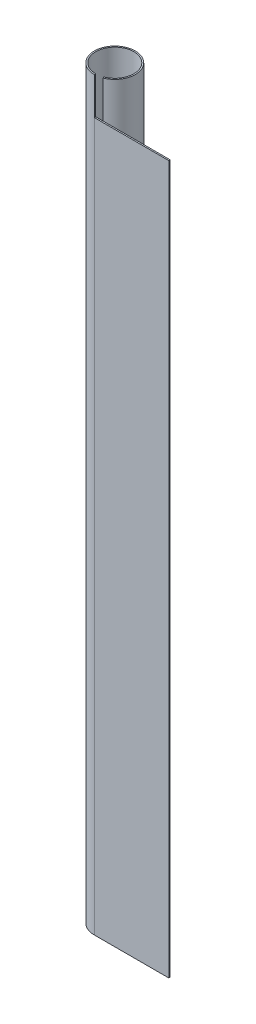
ISO-10303-21;
HEADER;
FILE_DESCRIPTION(('STEP AP214'),'2;1');
FILE_NAME('part.step','',(''),(''),'','','');
FILE_SCHEMA(('AUTOMOTIVE_DESIGN { 1 0 10303 214 1 1 1 1 }'));
ENDSEC;
DATA;
#1=APPLICATION_CONTEXT('core data for automotive mechanical design processes');
#2=APPLICATION_PROTOCOL_DEFINITION('international standard','automotive_design',2000,#1);
#3=PRODUCT_CONTEXT('',#1,'mechanical');
#4=PRODUCT('Part','Part','',(#3));
#5=PRODUCT_RELATED_PRODUCT_CATEGORY('part','',(#4));
#6=PRODUCT_DEFINITION_FORMATION('','',#4);
#7=PRODUCT_DEFINITION_CONTEXT('part definition',#1,'design');
#8=PRODUCT_DEFINITION('design','',#6,#7);
#9=PRODUCT_DEFINITION_SHAPE('','',#8);
#10=(LENGTH_UNIT() NAMED_UNIT(*) SI_UNIT(.MILLI.,.METRE.));
#11=(NAMED_UNIT(*) PLANE_ANGLE_UNIT() SI_UNIT($,.RADIAN.));
#12=(NAMED_UNIT(*) SI_UNIT($,.STERADIAN.) SOLID_ANGLE_UNIT());
#13=UNCERTAINTY_MEASURE_WITH_UNIT(LENGTH_MEASURE(1.E-05),#10,'distance_accuracy_value','');
#14=(GEOMETRIC_REPRESENTATION_CONTEXT(3) GLOBAL_UNCERTAINTY_ASSIGNED_CONTEXT((#13)) GLOBAL_UNIT_ASSIGNED_CONTEXT((#10,
#11,#12)) REPRESENTATION_CONTEXT('',''));
#15=CARTESIAN_POINT('',(0.,0.,0.));
#16=DIRECTION('',(0.,0.,1.));
#17=DIRECTION('',(1.,0.,0.));
#18=AXIS2_PLACEMENT_3D('',#15,#16,#17);
#19=CARTESIAN_POINT('',(0.,-400.,0.));
#20=DIRECTION('',(0.,-1.,0.));
#21=DIRECTION('',(0.,0.,-1.));
#22=AXIS2_PLACEMENT_3D('',#19,#20,#21);
#23=PLANE('',#22);
#24=DIRECTION('',(0.,0.,-1.));
#25=VECTOR('',#24,1.);
#26=CARTESIAN_POINT('',(0.,-400.,0.));
#27=LINE('',#26,#25);
#28=CARTESIAN_POINT('',(0.,-400.,0.));
#29=VERTEX_POINT('',#28);
#30=CARTESIAN_POINT('',(0.,-400.,-0.7366));
#31=VERTEX_POINT('',#30);
#32=EDGE_CURVE('E11',#29,#31,#27,.T.);
#33=ORIENTED_EDGE('',*,*,#32,.F.);
#34=CARTESIAN_POINT('',(0.,-400.,-11.));
#35=DIRECTION('',(0.,-1.,0.));
#36=DIRECTION('',(0.,0.,-1.));
#37=AXIS2_PLACEMENT_3D('',#34,#35,#36);
#38=CIRCLE('',#37,11.);
#39=CARTESIAN_POINT('',(3.99217985566783,-400.,-0.750000000000002));
#40=VERTEX_POINT('',#39);
#41=EDGE_CURVE('E118',#29,#40,#38,.T.);
#42=ORIENTED_EDGE('',*,*,#41,.T.);
#43=DIRECTION('',(-0.362925441424352,0.,-0.93181818181818));
#44=VECTOR('',#43,1.);
#45=CARTESIAN_POINT('',(3.99217985566783,-400.,-0.750000000000002));
#46=LINE('',#45,#44);
#47=CARTESIAN_POINT('',(3.72484897551465,-400.,-1.43637727272727));
#48=VERTEX_POINT('',#47);
#49=EDGE_CURVE('E83',#40,#48,#46,.T.);
#50=ORIENTED_EDGE('',*,*,#49,.T.);
#51=CARTESIAN_POINT('',(0.,-400.,-11.));
#52=DIRECTION('',(0.,1.,0.));
#53=DIRECTION('',(1.,0.,0.));
#54=AXIS2_PLACEMENT_3D('',#51,#52,#53);
#55=CIRCLE('',#54,10.2634);
#56=EDGE_CURVE('E133',#31,#48,#55,.F.);
#57=ORIENTED_EDGE('',*,*,#56,.F.);
#58=EDGE_LOOP('',(#33,#42,#50,#57));
#59=FACE_BOUND('',#58,.T.);
#60=ADVANCED_FACE('F36',(#59),#23,.T.);
#61=CARTESIAN_POINT('',(0.,0.,-0.7366));
#62=DIRECTION('',(0.,1.,0.));
#63=DIRECTION('',(0.,0.,1.));
#64=AXIS2_PLACEMENT_3D('',#61,#62,#63);
#65=PLANE('',#64);
#66=DIRECTION('',(0.,0.,1.));
#67=VECTOR('',#66,1.);
#68=CARTESIAN_POINT('',(0.,0.,-0.7366));
#69=LINE('',#68,#67);
#70=CARTESIAN_POINT('',(0.,0.,-0.7366));
#71=VERTEX_POINT('',#70);
#72=CARTESIAN_POINT('',(0.,0.,0.));
#73=VERTEX_POINT('',#72);
#74=EDGE_CURVE('E44',#71,#73,#69,.T.);
#75=ORIENTED_EDGE('',*,*,#74,.F.);
#76=CARTESIAN_POINT('',(0.,0.,-11.));
#77=DIRECTION('',(0.,1.,0.));
#78=DIRECTION('',(1.,0.,0.));
#79=AXIS2_PLACEMENT_3D('',#76,#77,#78);
#80=CIRCLE('',#79,10.2634);
#81=CARTESIAN_POINT('',(3.72484897551465,0.,-1.43637727272727));
#82=VERTEX_POINT('',#81);
#83=EDGE_CURVE('E125',#71,#82,#80,.F.);
#84=ORIENTED_EDGE('',*,*,#83,.T.);
#85=DIRECTION('',(-0.362925441424352,0.,-0.93181818181818));
#86=VECTOR('',#85,1.);
#87=CARTESIAN_POINT('',(3.99217985566783,0.,-0.750000000000002));
#88=LINE('',#87,#86);
#89=CARTESIAN_POINT('',(3.99217985566783,0.,-0.750000000000002));
#90=VERTEX_POINT('',#89);
#91=EDGE_CURVE('E128',#90,#82,#88,.T.);
#92=ORIENTED_EDGE('',*,*,#91,.F.);
#93=CARTESIAN_POINT('',(0.,0.,-11.));
#94=DIRECTION('',(0.,-1.,0.));
#95=DIRECTION('',(0.,0.,-1.));
#96=AXIS2_PLACEMENT_3D('',#93,#94,#95);
#97=CIRCLE('',#96,11.);
#98=EDGE_CURVE('E66',#73,#90,#97,.T.);
#99=ORIENTED_EDGE('',*,*,#98,.F.);
#100=EDGE_LOOP('',(#75,#84,#92,#99));
#101=FACE_BOUND('',#100,.T.);
#102=ADVANCED_FACE('F152',(#101),#65,.T.);
#103=CARTESIAN_POINT('',(0.,-400.,-11.));
#104=DIRECTION('',(0.,1.,0.));
#105=DIRECTION('',(0.,0.,1.));
#106=AXIS2_PLACEMENT_3D('',#103,#104,#105);
#107=CYLINDRICAL_SURFACE('',#106,10.2634);
#108=ORIENTED_EDGE('',*,*,#83,.F.);
#109=DIRECTION('',(0.,-1.,0.));
#110=VECTOR('',#109,1.);
#111=CARTESIAN_POINT('',(0.,0.,-0.7366));
#112=LINE('',#111,#110);
#113=CARTESIAN_POINT('',(0.,-20.,-0.7366));
#114=VERTEX_POINT('',#113);
#115=EDGE_CURVE('E74',#71,#114,#112,.T.);
#116=ORIENTED_EDGE('',*,*,#115,.T.);
#117=DIRECTION('',(0.,1.,0.));
#118=VECTOR('',#117,1.);
#119=CARTESIAN_POINT('',(0.,-400.,-0.7366));
#120=LINE('',#119,#118);
#121=EDGE_CURVE('E134',#31,#114,#120,.T.);
#122=ORIENTED_EDGE('',*,*,#121,.F.);
#123=ORIENTED_EDGE('',*,*,#56,.T.);
#124=DIRECTION('',(0.,1.,0.));
#125=VECTOR('',#124,1.);
#126=CARTESIAN_POINT('',(3.72484897551465,-400.,-1.43637727272727));
#127=LINE('',#126,#125);
#128=EDGE_CURVE('E124',#48,#82,#127,.T.);
#129=ORIENTED_EDGE('',*,*,#128,.T.);
#130=EDGE_LOOP('',(#108,#116,#122,#123,#129));
#131=FACE_BOUND('',#130,.T.);
#132=ADVANCED_FACE('F176',(#131),#107,.F.);
#133=CARTESIAN_POINT('',(0.,-400.,-0.7366));
#134=DIRECTION('',(0.,0.,-1.));
#135=DIRECTION('',(-1.,0.,0.));
#136=AXIS2_PLACEMENT_3D('',#133,#134,#135);
#137=PLANE('',#136);
#138=DIRECTION('',(1.,0.,0.));
#139=VECTOR('',#138,1.);
#140=CARTESIAN_POINT('',(0.,-20.,-0.7366));
#141=LINE('',#140,#139);
#142=CARTESIAN_POINT('',(40.,-20.,-0.7366));
#143=VERTEX_POINT('',#142);
#144=EDGE_CURVE('E163',#114,#143,#141,.T.);
#145=ORIENTED_EDGE('',*,*,#144,.T.);
#146=DIRECTION('',(0.,1.,0.));
#147=VECTOR('',#146,1.);
#148=CARTESIAN_POINT('',(40.,-400.,-0.7366));
#149=LINE('',#148,#147);
#150=CARTESIAN_POINT('',(40.,-400.,-0.7366));
#151=VERTEX_POINT('',#150);
#152=EDGE_CURVE('E112',#151,#143,#149,.T.);
#153=ORIENTED_EDGE('',*,*,#152,.F.);
#154=DIRECTION('',(1.,0.,0.));
#155=VECTOR('',#154,1.);
#156=CARTESIAN_POINT('',(0.,-400.,-0.7366));
#157=LINE('',#156,#155);
#158=EDGE_CURVE('E99',#151,#31,#157,.F.);
#159=ORIENTED_EDGE('',*,*,#158,.T.);
#160=ORIENTED_EDGE('',*,*,#121,.T.);
#161=EDGE_LOOP('',(#145,#153,#159,#160));
#162=FACE_BOUND('',#161,.T.);
#163=ADVANCED_FACE('F160',(#162),#137,.T.);
#164=CARTESIAN_POINT('',(40.,-400.,-0.7366));
#165=DIRECTION('',(-1.,0.,0.));
#166=DIRECTION('',(0.,0.,1.));
#167=AXIS2_PLACEMENT_3D('',#164,#165,#166);
#168=PLANE('',#167);
#169=ORIENTED_EDGE('',*,*,#152,.T.);
#170=DIRECTION('',(0.,0.,1.));
#171=VECTOR('',#170,1.);
#172=CARTESIAN_POINT('',(40.,-20.,-22.001));
#173=LINE('',#172,#171);
#174=CARTESIAN_POINT('',(40.,-20.,0.));
#175=VERTEX_POINT('',#174);
#176=EDGE_CURVE('E109',#143,#175,#173,.T.);
#177=ORIENTED_EDGE('',*,*,#176,.T.);
#178=DIRECTION('',(0.,1.,0.));
#179=VECTOR('',#178,1.);
#180=CARTESIAN_POINT('',(40.,-400.,0.));
#181=LINE('',#180,#179);
#182=CARTESIAN_POINT('',(40.,-400.,0.));
#183=VERTEX_POINT('',#182);
#184=EDGE_CURVE('E105',#183,#175,#181,.T.);
#185=ORIENTED_EDGE('',*,*,#184,.F.);
#186=DIRECTION('',(0.,0.,1.));
#187=VECTOR('',#186,1.);
#188=CARTESIAN_POINT('',(40.,-400.,-0.7366));
#189=LINE('',#188,#187);
#190=EDGE_CURVE('E92',#151,#183,#189,.T.);
#191=ORIENTED_EDGE('',*,*,#190,.F.);
#192=EDGE_LOOP('',(#169,#177,#185,#191));
#193=FACE_BOUND('',#192,.T.);
#194=ADVANCED_FACE('F106',(#193),#168,.F.);
#195=CARTESIAN_POINT('',(0.,-400.,0.));
#196=DIRECTION('',(0.,0.,-1.));
#197=DIRECTION('',(-1.,0.,0.));
#198=AXIS2_PLACEMENT_3D('',#195,#196,#197);
#199=PLANE('',#198);
#200=ORIENTED_EDGE('',*,*,#184,.T.);
#201=DIRECTION('',(1.,0.,0.));
#202=VECTOR('',#201,1.);
#203=CARTESIAN_POINT('',(0.,-20.,0.));
#204=LINE('',#203,#202);
#205=CARTESIAN_POINT('',(0.,-20.,0.));
#206=VERTEX_POINT('',#205);
#207=EDGE_CURVE('E129',#206,#175,#204,.T.);
#208=ORIENTED_EDGE('',*,*,#207,.F.);
#209=DIRECTION('',(0.,1.,0.));
#210=VECTOR('',#209,1.);
#211=CARTESIAN_POINT('',(0.,-400.,0.));
#212=LINE('',#211,#210);
#213=EDGE_CURVE('E113',#29,#206,#212,.T.);
#214=ORIENTED_EDGE('',*,*,#213,.F.);
#215=DIRECTION('',(-1.,0.,0.));
#216=VECTOR('',#215,1.);
#217=CARTESIAN_POINT('',(0.,-400.,0.));
#218=LINE('',#217,#216);
#219=EDGE_CURVE('E96',#183,#29,#218,.T.);
#220=ORIENTED_EDGE('',*,*,#219,.F.);
#221=EDGE_LOOP('',(#200,#208,#214,#220));
#222=FACE_BOUND('',#221,.T.);
#223=ADVANCED_FACE('F115',(#222),#199,.F.);
#224=CARTESIAN_POINT('',(0.,-400.,-11.));
#225=DIRECTION('',(0.,1.,0.));
#226=DIRECTION('',(0.,0.,1.));
#227=AXIS2_PLACEMENT_3D('',#224,#225,#226);
#228=CYLINDRICAL_SURFACE('',#227,11.);
#229=ORIENTED_EDGE('',*,*,#98,.T.);
#230=DIRECTION('',(0.,1.,0.));
#231=VECTOR('',#230,1.);
#232=CARTESIAN_POINT('',(3.99217985566783,-400.,-0.750000000000002));
#233=LINE('',#232,#231);
#234=EDGE_CURVE('E139',#40,#90,#233,.T.);
#235=ORIENTED_EDGE('',*,*,#234,.F.);
#236=ORIENTED_EDGE('',*,*,#41,.F.);
#237=ORIENTED_EDGE('',*,*,#213,.T.);
#238=DIRECTION('',(0.,-1.,0.));
#239=VECTOR('',#238,1.);
#240=CARTESIAN_POINT('',(0.,0.,0.));
#241=LINE('',#240,#239);
#242=EDGE_CURVE('E145',#73,#206,#241,.T.);
#243=ORIENTED_EDGE('',*,*,#242,.F.);
#244=EDGE_LOOP('',(#229,#235,#236,#237,#243));
#245=FACE_BOUND('',#244,.T.);
#246=ADVANCED_FACE('F148',(#245),#228,.T.);
#247=CARTESIAN_POINT('',(3.99217985566783,-400.,-0.750000000000002));
#248=DIRECTION('',(0.93181818181818,0.,-0.362925441424352));
#249=DIRECTION('',(-0.362925441424352,0.,-0.93181818181818));
#250=AXIS2_PLACEMENT_3D('',#247,#248,#249);
#251=PLANE('',#250);
#252=ORIENTED_EDGE('',*,*,#91,.T.);
#253=ORIENTED_EDGE('',*,*,#128,.F.);
#254=ORIENTED_EDGE('',*,*,#49,.F.);
#255=ORIENTED_EDGE('',*,*,#234,.T.);
#256=EDGE_LOOP('',(#252,#253,#254,#255));
#257=FACE_BOUND('',#256,.T.);
#258=ADVANCED_FACE('F154',(#257),#251,.F.);
#259=CARTESIAN_POINT('',(0.,-400.,-11.));
#260=DIRECTION('',(0.,1.,0.));
#261=DIRECTION('',(1.,0.,0.));
#262=AXIS2_PLACEMENT_3D('',#259,#260,#261);
#263=PLANE('',#262);
#264=ORIENTED_EDGE('',*,*,#219,.T.);
#265=ORIENTED_EDGE('',*,*,#32,.T.);
#266=ORIENTED_EDGE('',*,*,#158,.F.);
#267=ORIENTED_EDGE('',*,*,#190,.T.);
#268=EDGE_LOOP('',(#264,#265,#266,#267));
#269=FACE_BOUND('',#268,.T.);
#270=ADVANCED_FACE('F94',(#269),#263,.F.);
#271=CARTESIAN_POINT('',(0.,-20.,-22.001));
#272=DIRECTION('',(0.,-1.,0.));
#273=DIRECTION('',(1.,0.,0.));
#274=AXIS2_PLACEMENT_3D('',#271,#272,#273);
#275=PLANE('',#274);
#276=DIRECTION('',(0.,0.,1.));
#277=VECTOR('',#276,1.);
#278=CARTESIAN_POINT('',(0.,-20.,-22.001));
#279=LINE('',#278,#277);
#280=EDGE_CURVE('E149',#114,#206,#279,.T.);
#281=ORIENTED_EDGE('',*,*,#280,.T.);
#282=ORIENTED_EDGE('',*,*,#207,.T.);
#283=ORIENTED_EDGE('',*,*,#176,.F.);
#284=ORIENTED_EDGE('',*,*,#144,.F.);
#285=EDGE_LOOP('',(#281,#282,#283,#284));
#286=FACE_BOUND('',#285,.T.);
#287=ADVANCED_FACE('F170',(#286),#275,.F.);
#288=CARTESIAN_POINT('',(0.,0.,-22.001));
#289=DIRECTION('',(-1.,0.,0.));
#290=DIRECTION('',(0.,-1.,0.));
#291=AXIS2_PLACEMENT_3D('',#288,#289,#290);
#292=PLANE('',#291);
#293=ORIENTED_EDGE('',*,*,#74,.T.);
#294=ORIENTED_EDGE('',*,*,#242,.T.);
#295=ORIENTED_EDGE('',*,*,#280,.F.);
#296=ORIENTED_EDGE('',*,*,#115,.F.);
#297=EDGE_LOOP('',(#293,#294,#295,#296));
#298=FACE_BOUND('',#297,.T.);
#299=ADVANCED_FACE('F143',(#298),#292,.F.);
#300=CLOSED_SHELL('',(#60,#102,#132,#163,#194,#223,#246,#258,#270,#287,#299));
#301=MANIFOLD_SOLID_BREP('B2',#300);
#302=ADVANCED_BREP_SHAPE_REPRESENTATION('',(#18,#301),#14);
#303=SHAPE_DEFINITION_REPRESENTATION(#9,#302);
ENDSEC;
END-ISO-10303-21;
